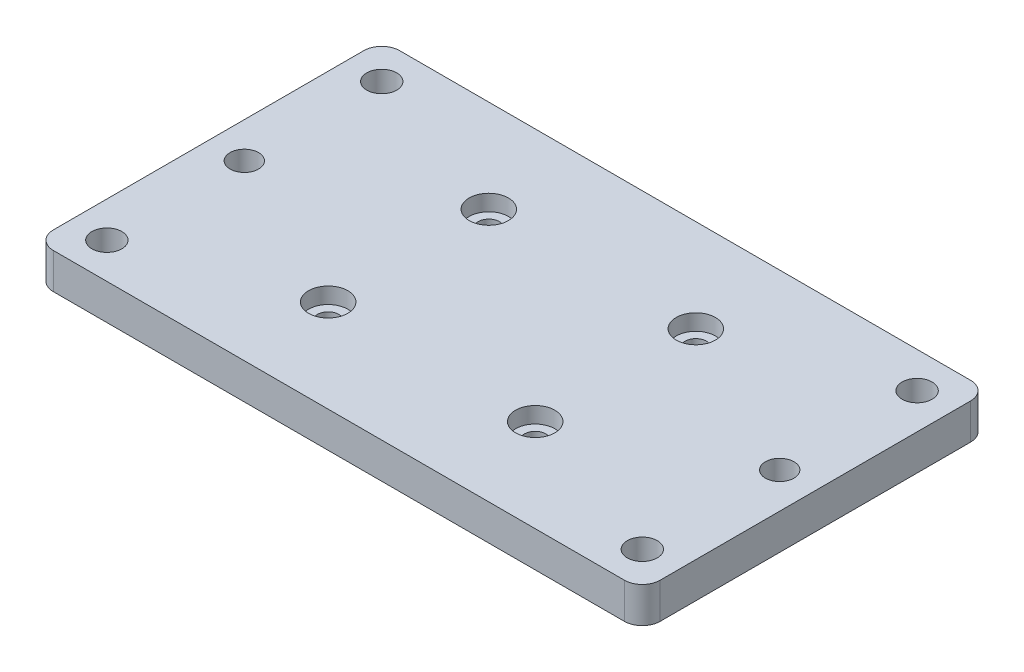
ISO-10303-21;
HEADER;
FILE_DESCRIPTION(('STEP AP214'),'2;1');
FILE_NAME('part.step','',(''),(''),'','','');
FILE_SCHEMA(('AUTOMOTIVE_DESIGN { 1 0 10303 214 1 1 1 1 }'));
ENDSEC;
DATA;
#1=APPLICATION_CONTEXT('core data for automotive mechanical design processes');
#2=APPLICATION_PROTOCOL_DEFINITION('international standard','automotive_design',2000,#1);
#3=PRODUCT_CONTEXT('',#1,'mechanical');
#4=PRODUCT('Part','Part','',(#3));
#5=PRODUCT_RELATED_PRODUCT_CATEGORY('part','',(#4));
#6=PRODUCT_DEFINITION_FORMATION('','',#4);
#7=PRODUCT_DEFINITION_CONTEXT('part definition',#1,'design');
#8=PRODUCT_DEFINITION('design','',#6,#7);
#9=PRODUCT_DEFINITION_SHAPE('','',#8);
#10=(LENGTH_UNIT() NAMED_UNIT(*) SI_UNIT(.MILLI.,.METRE.));
#11=(NAMED_UNIT(*) PLANE_ANGLE_UNIT() SI_UNIT($,.RADIAN.));
#12=(NAMED_UNIT(*) SI_UNIT($,.STERADIAN.) SOLID_ANGLE_UNIT());
#13=UNCERTAINTY_MEASURE_WITH_UNIT(LENGTH_MEASURE(1.E-05),#10,'distance_accuracy_value','');
#14=(GEOMETRIC_REPRESENTATION_CONTEXT(3) GLOBAL_UNCERTAINTY_ASSIGNED_CONTEXT((#13)) GLOBAL_UNIT_ASSIGNED_CONTEXT((#10,
#11,#12)) REPRESENTATION_CONTEXT('',''));
#15=CARTESIAN_POINT('',(0.,0.,0.));
#16=DIRECTION('',(0.,0.,1.));
#17=DIRECTION('',(1.,0.,0.));
#18=AXIS2_PLACEMENT_3D('',#15,#16,#17);
#19=CARTESIAN_POINT('',(0.,-10.,0.));
#20=DIRECTION('',(0.,-1.,0.));
#21=DIRECTION('',(0.,0.,-1.));
#22=AXIS2_PLACEMENT_3D('',#19,#20,#21);
#23=PLANE('',#22);
#24=CARTESIAN_POINT('',(-75.,-10.,0.));
#25=DIRECTION('',(0.,1.,0.));
#26=DIRECTION('',(0.,0.,1.));
#27=AXIS2_PLACEMENT_3D('',#24,#25,#26);
#28=CIRCLE('',#27,3.99999999999999);
#29=CARTESIAN_POINT('',(-75.,-10.,3.99999999999999));
#30=VERTEX_POINT('',#29);
#31=EDGE_CURVE('E489',#30,#30,#28,.T.);
#32=ORIENTED_EDGE('',*,*,#31,.T.);
#33=EDGE_LOOP('',(#32));
#34=FACE_BOUND('',#33,.T.);
#35=DIRECTION('',(0.,0.,1.));
#36=VECTOR('',#35,1.);
#37=CARTESIAN_POINT('',(-85.,-10.,48.5));
#38=LINE('',#37,#36);
#39=CARTESIAN_POINT('',(-85.,-10.,-43.5));
#40=VERTEX_POINT('',#39);
#41=CARTESIAN_POINT('',(-85.,-10.,43.5));
#42=VERTEX_POINT('',#41);
#43=EDGE_CURVE('E149',#40,#42,#38,.T.);
#44=ORIENTED_EDGE('',*,*,#43,.F.);
#45=CARTESIAN_POINT('',(-80.,-10.,-43.5));
#46=DIRECTION('',(0.,-1.,0.));
#47=DIRECTION('',(0.,0.,-1.));
#48=AXIS2_PLACEMENT_3D('',#45,#46,#47);
#49=CIRCLE('',#48,5.);
#50=CARTESIAN_POINT('',(-80.,-10.,-48.5));
#51=VERTEX_POINT('',#50);
#52=EDGE_CURVE('E176',#40,#51,#49,.T.);
#53=ORIENTED_EDGE('',*,*,#52,.T.);
#54=DIRECTION('',(-1.,0.,0.));
#55=VECTOR('',#54,1.);
#56=CARTESIAN_POINT('',(-85.,-10.,-48.5));
#57=LINE('',#56,#55);
#58=CARTESIAN_POINT('',(80.,-10.,-48.5));
#59=VERTEX_POINT('',#58);
#60=EDGE_CURVE('E233',#59,#51,#57,.T.);
#61=ORIENTED_EDGE('',*,*,#60,.F.);
#62=CARTESIAN_POINT('',(80.,-10.,-43.5));
#63=DIRECTION('',(0.,-1.,0.));
#64=DIRECTION('',(0.,0.,-1.));
#65=AXIS2_PLACEMENT_3D('',#62,#63,#64);
#66=CIRCLE('',#65,5.);
#67=CARTESIAN_POINT('',(85.,-10.,-43.5));
#68=VERTEX_POINT('',#67);
#69=EDGE_CURVE('E141',#59,#68,#66,.T.);
#70=ORIENTED_EDGE('',*,*,#69,.T.);
#71=DIRECTION('',(0.,0.,-1.));
#72=VECTOR('',#71,1.);
#73=CARTESIAN_POINT('',(85.,-10.,48.5));
#74=LINE('',#73,#72);
#75=CARTESIAN_POINT('',(85.,-10.,43.5));
#76=VERTEX_POINT('',#75);
#77=EDGE_CURVE('E229',#76,#68,#74,.T.);
#78=ORIENTED_EDGE('',*,*,#77,.F.);
#79=CARTESIAN_POINT('',(80.,-10.,43.5));
#80=DIRECTION('',(0.,-1.,0.));
#81=DIRECTION('',(0.,0.,-1.));
#82=AXIS2_PLACEMENT_3D('',#79,#80,#81);
#83=CIRCLE('',#82,5.);
#84=CARTESIAN_POINT('',(80.,-10.,48.5));
#85=VERTEX_POINT('',#84);
#86=EDGE_CURVE('E63',#76,#85,#83,.T.);
#87=ORIENTED_EDGE('',*,*,#86,.T.);
#88=DIRECTION('',(1.,0.,0.));
#89=VECTOR('',#88,1.);
#90=CARTESIAN_POINT('',(-85.,-10.,48.5));
#91=LINE('',#90,#89);
#92=CARTESIAN_POINT('',(-80.,-10.,48.5));
#93=VERTEX_POINT('',#92);
#94=EDGE_CURVE('E143',#93,#85,#91,.T.);
#95=ORIENTED_EDGE('',*,*,#94,.F.);
#96=CARTESIAN_POINT('',(-80.,-10.,43.5));
#97=DIRECTION('',(0.,-1.,0.));
#98=DIRECTION('',(0.,0.,-1.));
#99=AXIS2_PLACEMENT_3D('',#96,#97,#98);
#100=CIRCLE('',#99,5.);
#101=EDGE_CURVE('E173',#93,#42,#100,.T.);
#102=ORIENTED_EDGE('',*,*,#101,.T.);
#103=EDGE_LOOP('',(#44,#53,#61,#70,#78,#87,#95,#102));
#104=FACE_BOUND('',#103,.T.);
#105=CARTESIAN_POINT('',(29.,-10.,22.5));
#106=DIRECTION('',(0.,1.,0.));
#107=DIRECTION('',(0.,0.,1.));
#108=AXIS2_PLACEMENT_3D('',#105,#106,#107);
#109=CIRCLE('',#108,3.);
#110=CARTESIAN_POINT('',(29.,-10.,25.5));
#111=VERTEX_POINT('',#110);
#112=EDGE_CURVE('E225',#111,#111,#109,.T.);
#113=ORIENTED_EDGE('',*,*,#112,.T.);
#114=EDGE_LOOP('',(#113));
#115=FACE_BOUND('',#114,.T.);
#116=CARTESIAN_POINT('',(-29.,-10.,-22.5));
#117=DIRECTION('',(0.,1.,0.));
#118=DIRECTION('',(0.,0.,1.));
#119=AXIS2_PLACEMENT_3D('',#116,#117,#118);
#120=CIRCLE('',#119,3.);
#121=CARTESIAN_POINT('',(-29.,-10.,-19.5));
#122=VERTEX_POINT('',#121);
#123=EDGE_CURVE('E216',#122,#122,#120,.T.);
#124=ORIENTED_EDGE('',*,*,#123,.T.);
#125=EDGE_LOOP('',(#124));
#126=FACE_BOUND('',#125,.T.);
#127=CARTESIAN_POINT('',(-29.,-10.,22.5));
#128=DIRECTION('',(0.,1.,0.));
#129=DIRECTION('',(0.,0.,1.));
#130=AXIS2_PLACEMENT_3D('',#127,#128,#129);
#131=CIRCLE('',#130,3.);
#132=CARTESIAN_POINT('',(-29.,-10.,25.5));
#133=VERTEX_POINT('',#132);
#134=EDGE_CURVE('E209',#133,#133,#131,.T.);
#135=ORIENTED_EDGE('',*,*,#134,.T.);
#136=EDGE_LOOP('',(#135));
#137=FACE_BOUND('',#136,.T.);
#138=CARTESIAN_POINT('',(29.,-10.,-22.5));
#139=DIRECTION('',(0.,1.,0.));
#140=DIRECTION('',(0.,0.,1.));
#141=AXIS2_PLACEMENT_3D('',#138,#139,#140);
#142=CIRCLE('',#141,3.);
#143=CARTESIAN_POINT('',(29.,-10.,-19.5));
#144=VERTEX_POINT('',#143);
#145=EDGE_CURVE('E203',#144,#144,#142,.T.);
#146=ORIENTED_EDGE('',*,*,#145,.T.);
#147=EDGE_LOOP('',(#146));
#148=FACE_BOUND('',#147,.T.);
#149=CARTESIAN_POINT('',(75.,-10.,-38.5));
#150=DIRECTION('',(0.,1.,0.));
#151=DIRECTION('',(0.,0.,1.));
#152=AXIS2_PLACEMENT_3D('',#149,#150,#151);
#153=CIRCLE('',#152,4.2);
#154=CARTESIAN_POINT('',(75.,-10.,-34.3));
#155=VERTEX_POINT('',#154);
#156=EDGE_CURVE('E535',#155,#155,#153,.T.);
#157=ORIENTED_EDGE('',*,*,#156,.T.);
#158=EDGE_LOOP('',(#157));
#159=FACE_BOUND('',#158,.T.);
#160=CARTESIAN_POINT('',(75.,-10.,38.5));
#161=DIRECTION('',(0.,1.,0.));
#162=DIRECTION('',(0.,0.,1.));
#163=AXIS2_PLACEMENT_3D('',#160,#161,#162);
#164=CIRCLE('',#163,4.2);
#165=CARTESIAN_POINT('',(75.,-10.,42.7));
#166=VERTEX_POINT('',#165);
#167=EDGE_CURVE('E527',#166,#166,#164,.T.);
#168=ORIENTED_EDGE('',*,*,#167,.T.);
#169=EDGE_LOOP('',(#168));
#170=FACE_BOUND('',#169,.T.);
#171=CARTESIAN_POINT('',(-75.,-10.,-38.5));
#172=DIRECTION('',(0.,1.,0.));
#173=DIRECTION('',(0.,0.,1.));
#174=AXIS2_PLACEMENT_3D('',#171,#172,#173);
#175=CIRCLE('',#174,4.2);
#176=CARTESIAN_POINT('',(-75.,-10.,-34.3));
#177=VERTEX_POINT('',#176);
#178=EDGE_CURVE('E519',#177,#177,#175,.T.);
#179=ORIENTED_EDGE('',*,*,#178,.T.);
#180=EDGE_LOOP('',(#179));
#181=FACE_BOUND('',#180,.T.);
#182=CARTESIAN_POINT('',(-75.,-10.,38.5));
#183=DIRECTION('',(0.,1.,0.));
#184=DIRECTION('',(0.,0.,1.));
#185=AXIS2_PLACEMENT_3D('',#182,#183,#184);
#186=CIRCLE('',#185,4.2);
#187=CARTESIAN_POINT('',(-75.,-10.,42.7));
#188=VERTEX_POINT('',#187);
#189=EDGE_CURVE('E511',#188,#188,#186,.T.);
#190=ORIENTED_EDGE('',*,*,#189,.T.);
#191=EDGE_LOOP('',(#190));
#192=FACE_BOUND('',#191,.T.);
#193=CARTESIAN_POINT('',(75.,-10.,0.));
#194=DIRECTION('',(0.,1.,0.));
#195=DIRECTION('',(0.,0.,1.));
#196=AXIS2_PLACEMENT_3D('',#193,#194,#195);
#197=CIRCLE('',#196,3.99999999999999);
#198=CARTESIAN_POINT('',(75.,-10.,3.99999999999999));
#199=VERTEX_POINT('',#198);
#200=EDGE_CURVE('E503',#199,#199,#197,.T.);
#201=ORIENTED_EDGE('',*,*,#200,.T.);
#202=EDGE_LOOP('',(#201));
#203=FACE_BOUND('',#202,.T.);
#204=ADVANCED_FACE('F45',(#34,#104,#115,#126,#137,#148,#159,#170,#181,#192,#203),#23,.T.);
#205=CARTESIAN_POINT('',(29.,0.,22.5));
#206=DIRECTION('',(0.,1.,0.));
#207=DIRECTION('',(0.,0.,1.));
#208=AXIS2_PLACEMENT_3D('',#205,#206,#207);
#209=CYLINDRICAL_SURFACE('',#208,3.);
#210=ORIENTED_EDGE('',*,*,#112,.F.);
#211=EDGE_LOOP('',(#210));
#212=FACE_BOUND('',#211,.T.);
#213=CARTESIAN_POINT('',(29.,-4.5,22.5));
#214=DIRECTION('',(0.,1.,0.));
#215=DIRECTION('',(0.,0.,1.));
#216=AXIS2_PLACEMENT_3D('',#213,#214,#215);
#217=CIRCLE('',#216,3.);
#218=CARTESIAN_POINT('',(29.,-4.5,25.5));
#219=VERTEX_POINT('',#218);
#220=EDGE_CURVE('E49',#219,#219,#217,.F.);
#221=ORIENTED_EDGE('',*,*,#220,.F.);
#222=EDGE_LOOP('',(#221));
#223=FACE_BOUND('',#222,.T.);
#224=ADVANCED_FACE('F276',(#212,#223),#209,.F.);
#225=CARTESIAN_POINT('',(-29.,0.,-22.5));
#226=DIRECTION('',(0.,1.,0.));
#227=DIRECTION('',(0.,0.,1.));
#228=AXIS2_PLACEMENT_3D('',#225,#226,#227);
#229=CYLINDRICAL_SURFACE('',#228,3.);
#230=ORIENTED_EDGE('',*,*,#123,.F.);
#231=EDGE_LOOP('',(#230));
#232=FACE_BOUND('',#231,.T.);
#233=CARTESIAN_POINT('',(-29.,-4.5,-22.5));
#234=DIRECTION('',(0.,1.,0.));
#235=DIRECTION('',(0.,0.,1.));
#236=AXIS2_PLACEMENT_3D('',#233,#234,#235);
#237=CIRCLE('',#236,3.);
#238=CARTESIAN_POINT('',(-29.,-4.5,-19.5));
#239=VERTEX_POINT('',#238);
#240=EDGE_CURVE('E195',#239,#239,#237,.F.);
#241=ORIENTED_EDGE('',*,*,#240,.F.);
#242=EDGE_LOOP('',(#241));
#243=FACE_BOUND('',#242,.T.);
#244=ADVANCED_FACE('F283',(#232,#243),#229,.F.);
#245=CARTESIAN_POINT('',(-29.,0.,22.5));
#246=DIRECTION('',(0.,1.,0.));
#247=DIRECTION('',(0.,0.,1.));
#248=AXIS2_PLACEMENT_3D('',#245,#246,#247);
#249=CYLINDRICAL_SURFACE('',#248,3.);
#250=ORIENTED_EDGE('',*,*,#134,.F.);
#251=EDGE_LOOP('',(#250));
#252=FACE_BOUND('',#251,.T.);
#253=CARTESIAN_POINT('',(-29.,-4.5,22.5));
#254=DIRECTION('',(0.,1.,0.));
#255=DIRECTION('',(0.,0.,1.));
#256=AXIS2_PLACEMENT_3D('',#253,#254,#255);
#257=CIRCLE('',#256,3.);
#258=CARTESIAN_POINT('',(-29.,-4.5,25.5));
#259=VERTEX_POINT('',#258);
#260=EDGE_CURVE('E191',#259,#259,#257,.F.);
#261=ORIENTED_EDGE('',*,*,#260,.F.);
#262=EDGE_LOOP('',(#261));
#263=FACE_BOUND('',#262,.T.);
#264=ADVANCED_FACE('F326',(#252,#263),#249,.F.);
#265=CARTESIAN_POINT('',(29.,0.,-22.5));
#266=DIRECTION('',(0.,1.,0.));
#267=DIRECTION('',(0.,0.,1.));
#268=AXIS2_PLACEMENT_3D('',#265,#266,#267);
#269=CYLINDRICAL_SURFACE('',#268,3.);
#270=ORIENTED_EDGE('',*,*,#145,.F.);
#271=EDGE_LOOP('',(#270));
#272=FACE_BOUND('',#271,.T.);
#273=CARTESIAN_POINT('',(29.,-4.5,-22.5));
#274=DIRECTION('',(0.,1.,0.));
#275=DIRECTION('',(0.,0.,1.));
#276=AXIS2_PLACEMENT_3D('',#273,#274,#275);
#277=CIRCLE('',#276,3.);
#278=CARTESIAN_POINT('',(29.,-4.5,-19.5));
#279=VERTEX_POINT('',#278);
#280=EDGE_CURVE('E187',#279,#279,#277,.F.);
#281=ORIENTED_EDGE('',*,*,#280,.F.);
#282=EDGE_LOOP('',(#281));
#283=FACE_BOUND('',#282,.T.);
#284=ADVANCED_FACE('F299',(#272,#283),#269,.F.);
#285=CARTESIAN_POINT('',(85.,-10.,48.5));
#286=DIRECTION('',(1.,0.,0.));
#287=DIRECTION('',(0.,0.,-1.));
#288=AXIS2_PLACEMENT_3D('',#285,#286,#287);
#289=PLANE('',#288);
#290=ORIENTED_EDGE('',*,*,#77,.T.);
#291=DIRECTION('',(0.,1.,0.));
#292=VECTOR('',#291,1.);
#293=CARTESIAN_POINT('',(85.,-10.,-43.5));
#294=LINE('',#293,#292);
#295=CARTESIAN_POINT('',(85.,0.,-43.5));
#296=VERTEX_POINT('',#295);
#297=EDGE_CURVE('E11',#68,#296,#294,.T.);
#298=ORIENTED_EDGE('',*,*,#297,.T.);
#299=DIRECTION('',(0.,0.,-1.));
#300=VECTOR('',#299,1.);
#301=CARTESIAN_POINT('',(85.,0.,48.5));
#302=LINE('',#301,#300);
#303=CARTESIAN_POINT('',(85.,0.,43.5));
#304=VERTEX_POINT('',#303);
#305=EDGE_CURVE('E120',#304,#296,#302,.T.);
#306=ORIENTED_EDGE('',*,*,#305,.F.);
#307=DIRECTION('',(0.,1.,0.));
#308=VECTOR('',#307,1.);
#309=CARTESIAN_POINT('',(85.,-10.,43.5));
#310=LINE('',#309,#308);
#311=EDGE_CURVE('E55',#304,#76,#310,.F.);
#312=ORIENTED_EDGE('',*,*,#311,.T.);
#313=EDGE_LOOP('',(#290,#298,#306,#312));
#314=FACE_BOUND('',#313,.T.);
#315=ADVANCED_FACE('F262',(#314),#289,.T.);
#316=CARTESIAN_POINT('',(-85.,-10.,48.5));
#317=DIRECTION('',(0.,0.,1.));
#318=DIRECTION('',(1.,0.,0.));
#319=AXIS2_PLACEMENT_3D('',#316,#317,#318);
#320=PLANE('',#319);
#321=DIRECTION('',(1.,0.,0.));
#322=VECTOR('',#321,1.);
#323=CARTESIAN_POINT('',(-85.,0.,48.5));
#324=LINE('',#323,#322);
#325=CARTESIAN_POINT('',(-80.,0.,48.5));
#326=VERTEX_POINT('',#325);
#327=CARTESIAN_POINT('',(80.,0.,48.5));
#328=VERTEX_POINT('',#327);
#329=EDGE_CURVE('E152',#326,#328,#324,.T.);
#330=ORIENTED_EDGE('',*,*,#329,.F.);
#331=DIRECTION('',(0.,1.,0.));
#332=VECTOR('',#331,1.);
#333=CARTESIAN_POINT('',(-80.,-10.,48.5));
#334=LINE('',#333,#332);
#335=EDGE_CURVE('E70',#326,#93,#334,.F.);
#336=ORIENTED_EDGE('',*,*,#335,.T.);
#337=ORIENTED_EDGE('',*,*,#94,.T.);
#338=DIRECTION('',(0.,1.,0.));
#339=VECTOR('',#338,1.);
#340=CARTESIAN_POINT('',(80.,-10.,48.5));
#341=LINE('',#340,#339);
#342=EDGE_CURVE('E179',#85,#328,#341,.T.);
#343=ORIENTED_EDGE('',*,*,#342,.T.);
#344=EDGE_LOOP('',(#330,#336,#337,#343));
#345=FACE_BOUND('',#344,.T.);
#346=ADVANCED_FACE('F247',(#345),#320,.T.);
#347=CARTESIAN_POINT('',(-85.,-10.,48.5));
#348=DIRECTION('',(-1.,0.,0.));
#349=DIRECTION('',(0.,0.,1.));
#350=AXIS2_PLACEMENT_3D('',#347,#348,#349);
#351=PLANE('',#350);
#352=DIRECTION('',(0.,0.,1.));
#353=VECTOR('',#352,1.);
#354=CARTESIAN_POINT('',(-85.,0.,48.5));
#355=LINE('',#354,#353);
#356=CARTESIAN_POINT('',(-85.,0.,-43.5));
#357=VERTEX_POINT('',#356);
#358=CARTESIAN_POINT('',(-85.,0.,43.5));
#359=VERTEX_POINT('',#358);
#360=EDGE_CURVE('E137',#357,#359,#355,.T.);
#361=ORIENTED_EDGE('',*,*,#360,.F.);
#362=DIRECTION('',(0.,1.,0.));
#363=VECTOR('',#362,1.);
#364=CARTESIAN_POINT('',(-85.,-10.,-43.5));
#365=LINE('',#364,#363);
#366=EDGE_CURVE('E166',#357,#40,#365,.F.);
#367=ORIENTED_EDGE('',*,*,#366,.T.);
#368=ORIENTED_EDGE('',*,*,#43,.T.);
#369=DIRECTION('',(0.,1.,0.));
#370=VECTOR('',#369,1.);
#371=CARTESIAN_POINT('',(-85.,-10.,43.5));
#372=LINE('',#371,#370);
#373=EDGE_CURVE('E162',#42,#359,#372,.T.);
#374=ORIENTED_EDGE('',*,*,#373,.T.);
#375=EDGE_LOOP('',(#361,#367,#368,#374));
#376=FACE_BOUND('',#375,.T.);
#377=ADVANCED_FACE('F257',(#376),#351,.T.);
#378=CARTESIAN_POINT('',(-85.,-10.,-48.5));
#379=DIRECTION('',(0.,0.,-1.));
#380=DIRECTION('',(-1.,0.,0.));
#381=AXIS2_PLACEMENT_3D('',#378,#379,#380);
#382=PLANE('',#381);
#383=ORIENTED_EDGE('',*,*,#60,.T.);
#384=DIRECTION('',(0.,1.,0.));
#385=VECTOR('',#384,1.);
#386=CARTESIAN_POINT('',(-80.,-10.,-48.5));
#387=LINE('',#386,#385);
#388=CARTESIAN_POINT('',(-80.,0.,-48.5));
#389=VERTEX_POINT('',#388);
#390=EDGE_CURVE('E135',#51,#389,#387,.T.);
#391=ORIENTED_EDGE('',*,*,#390,.T.);
#392=DIRECTION('',(-1.,0.,0.));
#393=VECTOR('',#392,1.);
#394=CARTESIAN_POINT('',(-85.,0.,-48.5));
#395=LINE('',#394,#393);
#396=CARTESIAN_POINT('',(80.,0.,-48.5));
#397=VERTEX_POINT('',#396);
#398=EDGE_CURVE('E118',#397,#389,#395,.T.);
#399=ORIENTED_EDGE('',*,*,#398,.F.);
#400=DIRECTION('',(0.,1.,0.));
#401=VECTOR('',#400,1.);
#402=CARTESIAN_POINT('',(80.,-10.,-48.5));
#403=LINE('',#402,#401);
#404=EDGE_CURVE('E132',#397,#59,#403,.F.);
#405=ORIENTED_EDGE('',*,*,#404,.T.);
#406=EDGE_LOOP('',(#383,#391,#399,#405));
#407=FACE_BOUND('',#406,.T.);
#408=ADVANCED_FACE('F131',(#407),#382,.T.);
#409=CARTESIAN_POINT('',(0.,0.,0.));
#410=DIRECTION('',(0.,-1.,0.));
#411=DIRECTION('',(0.,0.,-1.));
#412=AXIS2_PLACEMENT_3D('',#409,#410,#411);
#413=PLANE('',#412);
#414=CARTESIAN_POINT('',(-75.,0.,0.));
#415=DIRECTION('',(0.,1.,0.));
#416=DIRECTION('',(0.,0.,1.));
#417=AXIS2_PLACEMENT_3D('',#414,#415,#416);
#418=CIRCLE('',#417,4.);
#419=CARTESIAN_POINT('',(-75.,0.,4.00000000000001));
#420=VERTEX_POINT('',#419);
#421=EDGE_CURVE('E492',#420,#420,#418,.T.);
#422=ORIENTED_EDGE('',*,*,#421,.F.);
#423=EDGE_LOOP('',(#422));
#424=FACE_BOUND('',#423,.T.);
#425=CARTESIAN_POINT('',(75.,0.,0.));
#426=DIRECTION('',(0.,1.,0.));
#427=DIRECTION('',(0.,0.,1.));
#428=AXIS2_PLACEMENT_3D('',#425,#426,#427);
#429=CIRCLE('',#428,4.);
#430=CARTESIAN_POINT('',(75.,0.,4.00000000000001));
#431=VERTEX_POINT('',#430);
#432=EDGE_CURVE('E497',#431,#431,#429,.T.);
#433=ORIENTED_EDGE('',*,*,#432,.F.);
#434=EDGE_LOOP('',(#433));
#435=FACE_BOUND('',#434,.T.);
#436=CARTESIAN_POINT('',(-75.,0.,38.5));
#437=DIRECTION('',(0.,1.,0.));
#438=DIRECTION('',(0.,0.,1.));
#439=AXIS2_PLACEMENT_3D('',#436,#437,#438);
#440=CIRCLE('',#439,4.2);
#441=CARTESIAN_POINT('',(-75.,0.,42.7));
#442=VERTEX_POINT('',#441);
#443=EDGE_CURVE('E507',#442,#442,#440,.T.);
#444=ORIENTED_EDGE('',*,*,#443,.F.);
#445=EDGE_LOOP('',(#444));
#446=FACE_BOUND('',#445,.T.);
#447=CARTESIAN_POINT('',(-75.,0.,-38.5));
#448=DIRECTION('',(0.,1.,0.));
#449=DIRECTION('',(0.,0.,1.));
#450=AXIS2_PLACEMENT_3D('',#447,#448,#449);
#451=CIRCLE('',#450,4.2);
#452=CARTESIAN_POINT('',(-75.,0.,-34.3));
#453=VERTEX_POINT('',#452);
#454=EDGE_CURVE('E515',#453,#453,#451,.T.);
#455=ORIENTED_EDGE('',*,*,#454,.F.);
#456=EDGE_LOOP('',(#455));
#457=FACE_BOUND('',#456,.T.);
#458=CARTESIAN_POINT('',(75.,0.,38.5));
#459=DIRECTION('',(0.,1.,0.));
#460=DIRECTION('',(0.,0.,1.));
#461=AXIS2_PLACEMENT_3D('',#458,#459,#460);
#462=CIRCLE('',#461,4.2);
#463=CARTESIAN_POINT('',(75.,0.,42.7));
#464=VERTEX_POINT('',#463);
#465=EDGE_CURVE('E523',#464,#464,#462,.T.);
#466=ORIENTED_EDGE('',*,*,#465,.F.);
#467=EDGE_LOOP('',(#466));
#468=FACE_BOUND('',#467,.T.);
#469=CARTESIAN_POINT('',(75.,0.,-38.5));
#470=DIRECTION('',(0.,1.,0.));
#471=DIRECTION('',(0.,0.,1.));
#472=AXIS2_PLACEMENT_3D('',#469,#470,#471);
#473=CIRCLE('',#472,4.2);
#474=CARTESIAN_POINT('',(75.,0.,-34.3));
#475=VERTEX_POINT('',#474);
#476=EDGE_CURVE('E531',#475,#475,#473,.T.);
#477=ORIENTED_EDGE('',*,*,#476,.F.);
#478=EDGE_LOOP('',(#477));
#479=FACE_BOUND('',#478,.T.);
#480=CARTESIAN_POINT('',(-29.,0.,22.5));
#481=DIRECTION('',(0.,1.,0.));
#482=DIRECTION('',(0.,0.,1.));
#483=AXIS2_PLACEMENT_3D('',#480,#481,#482);
#484=CIRCLE('',#483,5.5);
#485=CARTESIAN_POINT('',(-29.,0.,28.));
#486=VERTEX_POINT('',#485);
#487=EDGE_CURVE('E556',#486,#486,#484,.T.);
#488=ORIENTED_EDGE('',*,*,#487,.F.);
#489=EDGE_LOOP('',(#488));
#490=FACE_BOUND('',#489,.T.);
#491=CARTESIAN_POINT('',(29.,0.,22.5));
#492=DIRECTION('',(0.,1.,0.));
#493=DIRECTION('',(0.,0.,1.));
#494=AXIS2_PLACEMENT_3D('',#491,#492,#493);
#495=CIRCLE('',#494,5.5);
#496=CARTESIAN_POINT('',(29.,0.,28.));
#497=VERTEX_POINT('',#496);
#498=EDGE_CURVE('E548',#497,#497,#495,.T.);
#499=ORIENTED_EDGE('',*,*,#498,.F.);
#500=EDGE_LOOP('',(#499));
#501=FACE_BOUND('',#500,.T.);
#502=CARTESIAN_POINT('',(29.,0.,-22.5));
#503=DIRECTION('',(0.,1.,0.));
#504=DIRECTION('',(0.,0.,1.));
#505=AXIS2_PLACEMENT_3D('',#502,#503,#504);
#506=CIRCLE('',#505,5.5);
#507=CARTESIAN_POINT('',(29.,0.,-17.));
#508=VERTEX_POINT('',#507);
#509=EDGE_CURVE('E540',#508,#508,#506,.T.);
#510=ORIENTED_EDGE('',*,*,#509,.F.);
#511=EDGE_LOOP('',(#510));
#512=FACE_BOUND('',#511,.T.);
#513=CARTESIAN_POINT('',(-29.,0.,-22.5));
#514=DIRECTION('',(0.,1.,0.));
#515=DIRECTION('',(0.,0.,1.));
#516=AXIS2_PLACEMENT_3D('',#513,#514,#515);
#517=CIRCLE('',#516,5.5);
#518=CARTESIAN_POINT('',(-29.,0.,-17.));
#519=VERTEX_POINT('',#518);
#520=EDGE_CURVE('E219',#519,#519,#517,.T.);
#521=ORIENTED_EDGE('',*,*,#520,.F.);
#522=EDGE_LOOP('',(#521));
#523=FACE_BOUND('',#522,.T.);
#524=ORIENTED_EDGE('',*,*,#398,.T.);
#525=CARTESIAN_POINT('',(-80.,0.,-43.5));
#526=DIRECTION('',(0.,-1.,0.));
#527=DIRECTION('',(0.,0.,-1.));
#528=AXIS2_PLACEMENT_3D('',#525,#526,#527);
#529=CIRCLE('',#528,5.);
#530=EDGE_CURVE('E159',#389,#357,#529,.F.);
#531=ORIENTED_EDGE('',*,*,#530,.T.);
#532=ORIENTED_EDGE('',*,*,#360,.T.);
#533=CARTESIAN_POINT('',(-80.,0.,43.5));
#534=DIRECTION('',(0.,-1.,0.));
#535=DIRECTION('',(0.,0.,-1.));
#536=AXIS2_PLACEMENT_3D('',#533,#534,#535);
#537=CIRCLE('',#536,5.);
#538=EDGE_CURVE('E125',#359,#326,#537,.F.);
#539=ORIENTED_EDGE('',*,*,#538,.T.);
#540=ORIENTED_EDGE('',*,*,#329,.T.);
#541=CARTESIAN_POINT('',(80.,0.,43.5));
#542=DIRECTION('',(0.,-1.,0.));
#543=DIRECTION('',(0.,0.,-1.));
#544=AXIS2_PLACEMENT_3D('',#541,#542,#543);
#545=CIRCLE('',#544,5.);
#546=EDGE_CURVE('E126',#328,#304,#545,.F.);
#547=ORIENTED_EDGE('',*,*,#546,.T.);
#548=ORIENTED_EDGE('',*,*,#305,.T.);
#549=CARTESIAN_POINT('',(80.,0.,-43.5));
#550=DIRECTION('',(0.,-1.,0.));
#551=DIRECTION('',(0.,0.,-1.));
#552=AXIS2_PLACEMENT_3D('',#549,#550,#551);
#553=CIRCLE('',#552,5.);
#554=EDGE_CURVE('E115',#296,#397,#553,.F.);
#555=ORIENTED_EDGE('',*,*,#554,.T.);
#556=EDGE_LOOP('',(#524,#531,#532,#539,#540,#547,#548,#555));
#557=FACE_BOUND('',#556,.T.);
#558=ADVANCED_FACE('F117',(#424,#435,#446,#457,#468,#479,#490,#501,#512,#523,#557),#413,.F.);
#559=CARTESIAN_POINT('',(-80.,-10.,-43.5));
#560=DIRECTION('',(0.,1.,0.));
#561=DIRECTION('',(0.,0.,1.));
#562=AXIS2_PLACEMENT_3D('',#559,#560,#561);
#563=CYLINDRICAL_SURFACE('',#562,5.);
#564=ORIENTED_EDGE('',*,*,#52,.F.);
#565=ORIENTED_EDGE('',*,*,#366,.F.);
#566=ORIENTED_EDGE('',*,*,#530,.F.);
#567=ORIENTED_EDGE('',*,*,#390,.F.);
#568=EDGE_LOOP('',(#564,#565,#566,#567));
#569=FACE_BOUND('',#568,.T.);
#570=ADVANCED_FACE('F260',(#569),#563,.T.);
#571=CARTESIAN_POINT('',(-80.,-10.,43.5));
#572=DIRECTION('',(0.,1.,0.));
#573=DIRECTION('',(0.,0.,1.));
#574=AXIS2_PLACEMENT_3D('',#571,#572,#573);
#575=CYLINDRICAL_SURFACE('',#574,5.);
#576=ORIENTED_EDGE('',*,*,#101,.F.);
#577=ORIENTED_EDGE('',*,*,#335,.F.);
#578=ORIENTED_EDGE('',*,*,#538,.F.);
#579=ORIENTED_EDGE('',*,*,#373,.F.);
#580=EDGE_LOOP('',(#576,#577,#578,#579));
#581=FACE_BOUND('',#580,.T.);
#582=ADVANCED_FACE('F251',(#581),#575,.T.);
#583=CARTESIAN_POINT('',(80.,-10.,-43.5));
#584=DIRECTION('',(0.,1.,0.));
#585=DIRECTION('',(0.,0.,1.));
#586=AXIS2_PLACEMENT_3D('',#583,#584,#585);
#587=CYLINDRICAL_SURFACE('',#586,5.);
#588=ORIENTED_EDGE('',*,*,#69,.F.);
#589=ORIENTED_EDGE('',*,*,#404,.F.);
#590=ORIENTED_EDGE('',*,*,#554,.F.);
#591=ORIENTED_EDGE('',*,*,#297,.F.);
#592=EDGE_LOOP('',(#588,#589,#590,#591));
#593=FACE_BOUND('',#592,.T.);
#594=ADVANCED_FACE('F140',(#593),#587,.T.);
#595=CARTESIAN_POINT('',(80.,-10.,43.5));
#596=DIRECTION('',(0.,1.,0.));
#597=DIRECTION('',(0.,0.,1.));
#598=AXIS2_PLACEMENT_3D('',#595,#596,#597);
#599=CYLINDRICAL_SURFACE('',#598,5.);
#600=ORIENTED_EDGE('',*,*,#86,.F.);
#601=ORIENTED_EDGE('',*,*,#311,.F.);
#602=ORIENTED_EDGE('',*,*,#546,.F.);
#603=ORIENTED_EDGE('',*,*,#342,.F.);
#604=EDGE_LOOP('',(#600,#601,#602,#603));
#605=FACE_BOUND('',#604,.T.);
#606=ADVANCED_FACE('F47',(#605),#599,.T.);
#607=CARTESIAN_POINT('',(29.,-4.5,-22.5));
#608=DIRECTION('',(0.,1.,0.));
#609=DIRECTION('',(0.,0.,1.));
#610=AXIS2_PLACEMENT_3D('',#607,#608,#609);
#611=PLANE('',#610);
#612=CARTESIAN_POINT('',(29.,-4.5,-22.5));
#613=DIRECTION('',(0.,1.,0.));
#614=DIRECTION('',(0.,0.,1.));
#615=AXIS2_PLACEMENT_3D('',#612,#613,#614);
#616=CIRCLE('',#615,5.5);
#617=CARTESIAN_POINT('',(29.,-4.5,-17.));
#618=VERTEX_POINT('',#617);
#619=EDGE_CURVE('E544',#618,#618,#616,.T.);
#620=ORIENTED_EDGE('',*,*,#619,.T.);
#621=EDGE_LOOP('',(#620));
#622=FACE_BOUND('',#621,.T.);
#623=ORIENTED_EDGE('',*,*,#280,.T.);
#624=EDGE_LOOP('',(#623));
#625=FACE_BOUND('',#624,.T.);
#626=ADVANCED_FACE('F266',(#622,#625),#611,.T.);
#627=CARTESIAN_POINT('',(29.,-4.5,-22.5));
#628=DIRECTION('',(0.,1.,0.));
#629=DIRECTION('',(0.,0.,1.));
#630=AXIS2_PLACEMENT_3D('',#627,#628,#629);
#631=CYLINDRICAL_SURFACE('',#630,5.5);
#632=ORIENTED_EDGE('',*,*,#619,.F.);
#633=EDGE_LOOP('',(#632));
#634=FACE_BOUND('',#633,.T.);
#635=ORIENTED_EDGE('',*,*,#509,.T.);
#636=EDGE_LOOP('',(#635));
#637=FACE_BOUND('',#636,.T.);
#638=ADVANCED_FACE('F272',(#634,#637),#631,.F.);
#639=CARTESIAN_POINT('',(-29.,-4.5,22.5));
#640=DIRECTION('',(0.,1.,0.));
#641=DIRECTION('',(0.,0.,1.));
#642=AXIS2_PLACEMENT_3D('',#639,#640,#641);
#643=PLANE('',#642);
#644=CARTESIAN_POINT('',(-29.,-4.5,22.5));
#645=DIRECTION('',(0.,1.,0.));
#646=DIRECTION('',(0.,0.,1.));
#647=AXIS2_PLACEMENT_3D('',#644,#645,#646);
#648=CIRCLE('',#647,5.5);
#649=CARTESIAN_POINT('',(-29.,-4.5,28.));
#650=VERTEX_POINT('',#649);
#651=EDGE_CURVE('E539',#650,#650,#648,.T.);
#652=ORIENTED_EDGE('',*,*,#651,.T.);
#653=EDGE_LOOP('',(#652));
#654=FACE_BOUND('',#653,.T.);
#655=ORIENTED_EDGE('',*,*,#260,.T.);
#656=EDGE_LOOP('',(#655));
#657=FACE_BOUND('',#656,.T.);
#658=ADVANCED_FACE('F361',(#654,#657),#643,.T.);
#659=CARTESIAN_POINT('',(-29.,-4.5,22.5));
#660=DIRECTION('',(0.,1.,0.));
#661=DIRECTION('',(0.,0.,1.));
#662=AXIS2_PLACEMENT_3D('',#659,#660,#661);
#663=CYLINDRICAL_SURFACE('',#662,5.5);
#664=ORIENTED_EDGE('',*,*,#651,.F.);
#665=EDGE_LOOP('',(#664));
#666=FACE_BOUND('',#665,.T.);
#667=ORIENTED_EDGE('',*,*,#487,.T.);
#668=EDGE_LOOP('',(#667));
#669=FACE_BOUND('',#668,.T.);
#670=ADVANCED_FACE('F371',(#666,#669),#663,.F.);
#671=CARTESIAN_POINT('',(-29.,-4.5,-22.5));
#672=DIRECTION('',(0.,1.,0.));
#673=DIRECTION('',(0.,0.,1.));
#674=AXIS2_PLACEMENT_3D('',#671,#672,#673);
#675=PLANE('',#674);
#676=CARTESIAN_POINT('',(-29.,-4.5,-22.5));
#677=DIRECTION('',(0.,1.,0.));
#678=DIRECTION('',(0.,0.,1.));
#679=AXIS2_PLACEMENT_3D('',#676,#677,#678);
#680=CIRCLE('',#679,5.5);
#681=CARTESIAN_POINT('',(-29.,-4.5,-17.));
#682=VERTEX_POINT('',#681);
#683=EDGE_CURVE('E192',#682,#682,#680,.T.);
#684=ORIENTED_EDGE('',*,*,#683,.T.);
#685=EDGE_LOOP('',(#684));
#686=FACE_BOUND('',#685,.T.);
#687=ORIENTED_EDGE('',*,*,#240,.T.);
#688=EDGE_LOOP('',(#687));
#689=FACE_BOUND('',#688,.T.);
#690=ADVANCED_FACE('F381',(#686,#689),#675,.T.);
#691=CARTESIAN_POINT('',(-29.,-4.5,-22.5));
#692=DIRECTION('',(0.,1.,0.));
#693=DIRECTION('',(0.,0.,1.));
#694=AXIS2_PLACEMENT_3D('',#691,#692,#693);
#695=CYLINDRICAL_SURFACE('',#694,5.5);
#696=ORIENTED_EDGE('',*,*,#683,.F.);
#697=EDGE_LOOP('',(#696));
#698=FACE_BOUND('',#697,.T.);
#699=ORIENTED_EDGE('',*,*,#520,.T.);
#700=EDGE_LOOP('',(#699));
#701=FACE_BOUND('',#700,.T.);
#702=ADVANCED_FACE('F391',(#698,#701),#695,.F.);
#703=CARTESIAN_POINT('',(29.,-4.5,22.5));
#704=DIRECTION('',(0.,1.,0.));
#705=DIRECTION('',(0.,0.,1.));
#706=AXIS2_PLACEMENT_3D('',#703,#704,#705);
#707=PLANE('',#706);
#708=CARTESIAN_POINT('',(29.,-4.5,22.5));
#709=DIRECTION('',(0.,1.,0.));
#710=DIRECTION('',(0.,0.,1.));
#711=AXIS2_PLACEMENT_3D('',#708,#709,#710);
#712=CIRCLE('',#711,5.5);
#713=CARTESIAN_POINT('',(29.,-4.5,28.));
#714=VERTEX_POINT('',#713);
#715=EDGE_CURVE('E552',#714,#714,#712,.T.);
#716=ORIENTED_EDGE('',*,*,#715,.T.);
#717=EDGE_LOOP('',(#716));
#718=FACE_BOUND('',#717,.T.);
#719=ORIENTED_EDGE('',*,*,#220,.T.);
#720=EDGE_LOOP('',(#719));
#721=FACE_BOUND('',#720,.T.);
#722=ADVANCED_FACE('F401',(#718,#721),#707,.T.);
#723=CARTESIAN_POINT('',(29.,-4.5,22.5));
#724=DIRECTION('',(0.,1.,0.));
#725=DIRECTION('',(0.,0.,1.));
#726=AXIS2_PLACEMENT_3D('',#723,#724,#725);
#727=CYLINDRICAL_SURFACE('',#726,5.5);
#728=ORIENTED_EDGE('',*,*,#715,.F.);
#729=EDGE_LOOP('',(#728));
#730=FACE_BOUND('',#729,.T.);
#731=ORIENTED_EDGE('',*,*,#498,.T.);
#732=EDGE_LOOP('',(#731));
#733=FACE_BOUND('',#732,.T.);
#734=ADVANCED_FACE('F411',(#730,#733),#727,.F.);
#735=CARTESIAN_POINT('',(75.,0.,-38.5));
#736=DIRECTION('',(0.,1.,0.));
#737=DIRECTION('',(0.,0.,1.));
#738=AXIS2_PLACEMENT_3D('',#735,#736,#737);
#739=CYLINDRICAL_SURFACE('',#738,4.2);
#740=ORIENTED_EDGE('',*,*,#156,.F.);
#741=EDGE_LOOP('',(#740));
#742=FACE_BOUND('',#741,.T.);
#743=ORIENTED_EDGE('',*,*,#476,.T.);
#744=EDGE_LOOP('',(#743));
#745=FACE_BOUND('',#744,.T.);
#746=ADVANCED_FACE('F421',(#742,#745),#739,.F.);
#747=CARTESIAN_POINT('',(75.,0.,38.5));
#748=DIRECTION('',(0.,1.,0.));
#749=DIRECTION('',(0.,0.,1.));
#750=AXIS2_PLACEMENT_3D('',#747,#748,#749);
#751=CYLINDRICAL_SURFACE('',#750,4.2);
#752=ORIENTED_EDGE('',*,*,#167,.F.);
#753=EDGE_LOOP('',(#752));
#754=FACE_BOUND('',#753,.T.);
#755=ORIENTED_EDGE('',*,*,#465,.T.);
#756=EDGE_LOOP('',(#755));
#757=FACE_BOUND('',#756,.T.);
#758=ADVANCED_FACE('F431',(#754,#757),#751,.F.);
#759=CARTESIAN_POINT('',(-75.,0.,-38.5));
#760=DIRECTION('',(0.,1.,0.));
#761=DIRECTION('',(0.,0.,1.));
#762=AXIS2_PLACEMENT_3D('',#759,#760,#761);
#763=CYLINDRICAL_SURFACE('',#762,4.2);
#764=ORIENTED_EDGE('',*,*,#178,.F.);
#765=EDGE_LOOP('',(#764));
#766=FACE_BOUND('',#765,.T.);
#767=ORIENTED_EDGE('',*,*,#454,.T.);
#768=EDGE_LOOP('',(#767));
#769=FACE_BOUND('',#768,.T.);
#770=ADVANCED_FACE('F441',(#766,#769),#763,.F.);
#771=CARTESIAN_POINT('',(-75.,0.,38.5));
#772=DIRECTION('',(0.,1.,0.));
#773=DIRECTION('',(0.,0.,1.));
#774=AXIS2_PLACEMENT_3D('',#771,#772,#773);
#775=CYLINDRICAL_SURFACE('',#774,4.2);
#776=ORIENTED_EDGE('',*,*,#189,.F.);
#777=EDGE_LOOP('',(#776));
#778=FACE_BOUND('',#777,.T.);
#779=ORIENTED_EDGE('',*,*,#443,.T.);
#780=EDGE_LOOP('',(#779));
#781=FACE_BOUND('',#780,.T.);
#782=ADVANCED_FACE('F451',(#778,#781),#775,.F.);
#783=CARTESIAN_POINT('',(75.,0.,0.));
#784=DIRECTION('',(0.,1.,0.));
#785=DIRECTION('',(0.,0.,1.));
#786=AXIS2_PLACEMENT_3D('',#783,#784,#785);
#787=CYLINDRICAL_SURFACE('',#786,4.);
#788=ORIENTED_EDGE('',*,*,#200,.F.);
#789=EDGE_LOOP('',(#788));
#790=FACE_BOUND('',#789,.T.);
#791=ORIENTED_EDGE('',*,*,#432,.T.);
#792=EDGE_LOOP('',(#791));
#793=FACE_BOUND('',#792,.T.);
#794=ADVANCED_FACE('F460',(#790,#793),#787,.F.);
#795=CARTESIAN_POINT('',(-75.,0.,0.));
#796=DIRECTION('',(0.,1.,0.));
#797=DIRECTION('',(0.,0.,1.));
#798=AXIS2_PLACEMENT_3D('',#795,#796,#797);
#799=CYLINDRICAL_SURFACE('',#798,4.);
#800=ORIENTED_EDGE('',*,*,#31,.F.);
#801=EDGE_LOOP('',(#800));
#802=FACE_BOUND('',#801,.T.);
#803=ORIENTED_EDGE('',*,*,#421,.T.);
#804=EDGE_LOOP('',(#803));
#805=FACE_BOUND('',#804,.T.);
#806=ADVANCED_FACE('F474',(#802,#805),#799,.F.);
#807=CLOSED_SHELL('',(#204,#224,#244,#264,#284,#315,#346,#377,#408,#558,#570,#582,#594,#606,
#626,#638,#658,#670,#690,#702,#722,#734,#746,#758,#770,#782,#794,#806));
#808=MANIFOLD_SOLID_BREP('B2',#807);
#809=ADVANCED_BREP_SHAPE_REPRESENTATION('',(#18,#808),#14);
#810=SHAPE_DEFINITION_REPRESENTATION(#9,#809);
ENDSEC;
END-ISO-10303-21;
